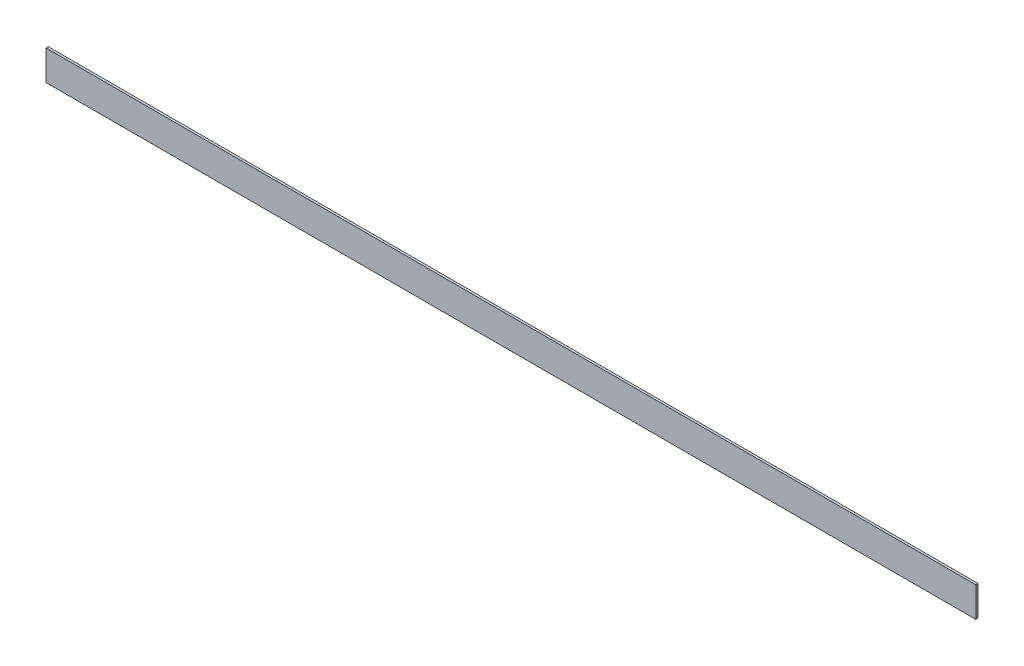
ISO-10303-21;
HEADER;
FILE_DESCRIPTION(('STEP AP214'),'2;1');
FILE_NAME('part.step','',(''),(''),'','','');
FILE_SCHEMA(('AUTOMOTIVE_DESIGN { 1 0 10303 214 1 1 1 1 }'));
ENDSEC;
DATA;
#1=APPLICATION_CONTEXT('core data for automotive mechanical design processes');
#2=APPLICATION_PROTOCOL_DEFINITION('international standard','automotive_design',2000,#1);
#3=PRODUCT_CONTEXT('',#1,'mechanical');
#4=PRODUCT('Part','Part','',(#3));
#5=PRODUCT_RELATED_PRODUCT_CATEGORY('part','',(#4));
#6=PRODUCT_DEFINITION_FORMATION('','',#4);
#7=PRODUCT_DEFINITION_CONTEXT('part definition',#1,'design');
#8=PRODUCT_DEFINITION('design','',#6,#7);
#9=PRODUCT_DEFINITION_SHAPE('','',#8);
#10=(LENGTH_UNIT() NAMED_UNIT(*) SI_UNIT(.MILLI.,.METRE.));
#11=(NAMED_UNIT(*) PLANE_ANGLE_UNIT() SI_UNIT($,.RADIAN.));
#12=(NAMED_UNIT(*) SI_UNIT($,.STERADIAN.) SOLID_ANGLE_UNIT());
#13=UNCERTAINTY_MEASURE_WITH_UNIT(LENGTH_MEASURE(1.E-05),#10,'distance_accuracy_value','');
#14=(GEOMETRIC_REPRESENTATION_CONTEXT(3) GLOBAL_UNCERTAINTY_ASSIGNED_CONTEXT((#13)) GLOBAL_UNIT_ASSIGNED_CONTEXT((#10,
#11,#12)) REPRESENTATION_CONTEXT('',''));
#15=CARTESIAN_POINT('',(0.,0.,0.));
#16=DIRECTION('',(0.,0.,1.));
#17=DIRECTION('',(1.,0.,0.));
#18=AXIS2_PLACEMENT_3D('',#15,#16,#17);
#19=CARTESIAN_POINT('',(40.,1052.,-21.5));
#20=DIRECTION('',(-1.,0.,0.));
#21=DIRECTION('',(0.,0.,1.));
#22=AXIS2_PLACEMENT_3D('',#19,#20,#21);
#23=PLANE('',#22);
#24=DIRECTION('',(0.,-1.,0.));
#25=VECTOR('',#24,1.);
#26=CARTESIAN_POINT('',(40.,1052.,-20.));
#27=LINE('',#26,#25);
#28=CARTESIAN_POINT('',(40.,1072.,-20.));
#29=VERTEX_POINT('',#28);
#30=CARTESIAN_POINT('',(40.,1052.,-20.));
#31=VERTEX_POINT('',#30);
#32=EDGE_CURVE('E103',#29,#31,#27,.T.);
#33=ORIENTED_EDGE('',*,*,#32,.F.);
#34=DIRECTION('',(0.,0.,1.));
#35=VECTOR('',#34,1.);
#36=CARTESIAN_POINT('',(40.,1072.,-21.5));
#37=LINE('',#36,#35);
#38=CARTESIAN_POINT('',(40.,1072.,-21.5));
#39=VERTEX_POINT('',#38);
#40=EDGE_CURVE('E11',#39,#29,#37,.T.);
#41=ORIENTED_EDGE('',*,*,#40,.F.);
#42=DIRECTION('',(0.,-1.,0.));
#43=VECTOR('',#42,1.);
#44=CARTESIAN_POINT('',(40.,1052.,-21.5));
#45=LINE('',#44,#43);
#46=CARTESIAN_POINT('',(40.,1052.,-21.5));
#47=VERTEX_POINT('',#46);
#48=EDGE_CURVE('E97',#39,#47,#45,.T.);
#49=ORIENTED_EDGE('',*,*,#48,.T.);
#50=DIRECTION('',(0.,0.,1.));
#51=VECTOR('',#50,1.);
#52=CARTESIAN_POINT('',(40.,1052.,-21.5));
#53=LINE('',#52,#51);
#54=EDGE_CURVE('E42',#47,#31,#53,.T.);
#55=ORIENTED_EDGE('',*,*,#54,.T.);
#56=EDGE_LOOP('',(#33,#41,#49,#55));
#57=FACE_BOUND('',#56,.T.);
#58=ADVANCED_FACE('F39',(#57),#23,.T.);
#59=CARTESIAN_POINT('',(40.,1072.,-21.5));
#60=DIRECTION('',(0.,1.,0.));
#61=DIRECTION('',(0.,0.,1.));
#62=AXIS2_PLACEMENT_3D('',#59,#60,#61);
#63=PLANE('',#62);
#64=DIRECTION('',(-1.,0.,0.));
#65=VECTOR('',#64,1.);
#66=CARTESIAN_POINT('',(40.,1072.,-20.));
#67=LINE('',#66,#65);
#68=CARTESIAN_POINT('',(660.,1072.,-20.));
#69=VERTEX_POINT('',#68);
#70=EDGE_CURVE('E99',#69,#29,#67,.T.);
#71=ORIENTED_EDGE('',*,*,#70,.F.);
#72=DIRECTION('',(0.,0.,1.));
#73=VECTOR('',#72,1.);
#74=CARTESIAN_POINT('',(660.,1072.,-21.5));
#75=LINE('',#74,#73);
#76=CARTESIAN_POINT('',(660.,1072.,-21.5));
#77=VERTEX_POINT('',#76);
#78=EDGE_CURVE('E48',#77,#69,#75,.T.);
#79=ORIENTED_EDGE('',*,*,#78,.F.);
#80=DIRECTION('',(-1.,0.,0.));
#81=VECTOR('',#80,1.);
#82=CARTESIAN_POINT('',(40.,1072.,-21.5));
#83=LINE('',#82,#81);
#84=EDGE_CURVE('E94',#77,#39,#83,.T.);
#85=ORIENTED_EDGE('',*,*,#84,.T.);
#86=ORIENTED_EDGE('',*,*,#40,.T.);
#87=EDGE_LOOP('',(#71,#79,#85,#86));
#88=FACE_BOUND('',#87,.T.);
#89=ADVANCED_FACE('F113',(#88),#63,.T.);
#90=CARTESIAN_POINT('',(660.,1052.,-21.5));
#91=DIRECTION('',(1.,0.,0.));
#92=DIRECTION('',(0.,0.,-1.));
#93=AXIS2_PLACEMENT_3D('',#90,#91,#92);
#94=PLANE('',#93);
#95=DIRECTION('',(0.,1.,0.));
#96=VECTOR('',#95,1.);
#97=CARTESIAN_POINT('',(660.,1052.,-20.));
#98=LINE('',#97,#96);
#99=CARTESIAN_POINT('',(660.,1052.,-20.));
#100=VERTEX_POINT('',#99);
#101=EDGE_CURVE('E89',#100,#69,#98,.T.);
#102=ORIENTED_EDGE('',*,*,#101,.F.);
#103=DIRECTION('',(0.,0.,1.));
#104=VECTOR('',#103,1.);
#105=CARTESIAN_POINT('',(660.,1052.,-21.5));
#106=LINE('',#105,#104);
#107=CARTESIAN_POINT('',(660.,1052.,-21.5));
#108=VERTEX_POINT('',#107);
#109=EDGE_CURVE('E84',#108,#100,#106,.T.);
#110=ORIENTED_EDGE('',*,*,#109,.F.);
#111=DIRECTION('',(0.,1.,0.));
#112=VECTOR('',#111,1.);
#113=CARTESIAN_POINT('',(660.,1052.,-21.5));
#114=LINE('',#113,#112);
#115=EDGE_CURVE('E87',#108,#77,#114,.T.);
#116=ORIENTED_EDGE('',*,*,#115,.T.);
#117=ORIENTED_EDGE('',*,*,#78,.T.);
#118=EDGE_LOOP('',(#102,#110,#116,#117));
#119=FACE_BOUND('',#118,.T.);
#120=ADVANCED_FACE('F86',(#119),#94,.T.);
#121=CARTESIAN_POINT('',(40.,1052.,-21.5));
#122=DIRECTION('',(0.,-1.,0.));
#123=DIRECTION('',(0.,0.,-1.));
#124=AXIS2_PLACEMENT_3D('',#121,#122,#123);
#125=PLANE('',#124);
#126=DIRECTION('',(1.,0.,0.));
#127=VECTOR('',#126,1.);
#128=CARTESIAN_POINT('',(40.,1052.,-20.));
#129=LINE('',#128,#127);
#130=EDGE_CURVE('E106',#31,#100,#129,.T.);
#131=ORIENTED_EDGE('',*,*,#130,.F.);
#132=ORIENTED_EDGE('',*,*,#54,.F.);
#133=DIRECTION('',(1.,0.,0.));
#134=VECTOR('',#133,1.);
#135=CARTESIAN_POINT('',(40.,1052.,-21.5));
#136=LINE('',#135,#134);
#137=EDGE_CURVE('E93',#47,#108,#136,.T.);
#138=ORIENTED_EDGE('',*,*,#137,.T.);
#139=ORIENTED_EDGE('',*,*,#109,.T.);
#140=EDGE_LOOP('',(#131,#132,#138,#139));
#141=FACE_BOUND('',#140,.T.);
#142=ADVANCED_FACE('F96',(#141),#125,.T.);
#143=CARTESIAN_POINT('',(0.,0.,-21.5));
#144=DIRECTION('',(0.,0.,-1.));
#145=DIRECTION('',(-1.,0.,0.));
#146=AXIS2_PLACEMENT_3D('',#143,#144,#145);
#147=PLANE('',#146);
#148=ORIENTED_EDGE('',*,*,#48,.F.);
#149=ORIENTED_EDGE('',*,*,#84,.F.);
#150=ORIENTED_EDGE('',*,*,#115,.F.);
#151=ORIENTED_EDGE('',*,*,#137,.F.);
#152=EDGE_LOOP('',(#148,#149,#150,#151));
#153=FACE_BOUND('',#152,.T.);
#154=ADVANCED_FACE('F92',(#153),#147,.T.);
#155=CARTESIAN_POINT('',(0.,0.,-20.));
#156=DIRECTION('',(0.,0.,-1.));
#157=DIRECTION('',(-1.,0.,0.));
#158=AXIS2_PLACEMENT_3D('',#155,#156,#157);
#159=PLANE('',#158);
#160=ORIENTED_EDGE('',*,*,#32,.T.);
#161=ORIENTED_EDGE('',*,*,#130,.T.);
#162=ORIENTED_EDGE('',*,*,#101,.T.);
#163=ORIENTED_EDGE('',*,*,#70,.T.);
#164=EDGE_LOOP('',(#160,#161,#162,#163));
#165=FACE_BOUND('',#164,.T.);
#166=ADVANCED_FACE('F112',(#165),#159,.F.);
#167=CLOSED_SHELL('',(#58,#89,#120,#142,#154,#166));
#168=MANIFOLD_SOLID_BREP('B2',#167);
#169=ADVANCED_BREP_SHAPE_REPRESENTATION('',(#18,#168),#14);
#170=SHAPE_DEFINITION_REPRESENTATION(#9,#169);
ENDSEC;
END-ISO-10303-21;
